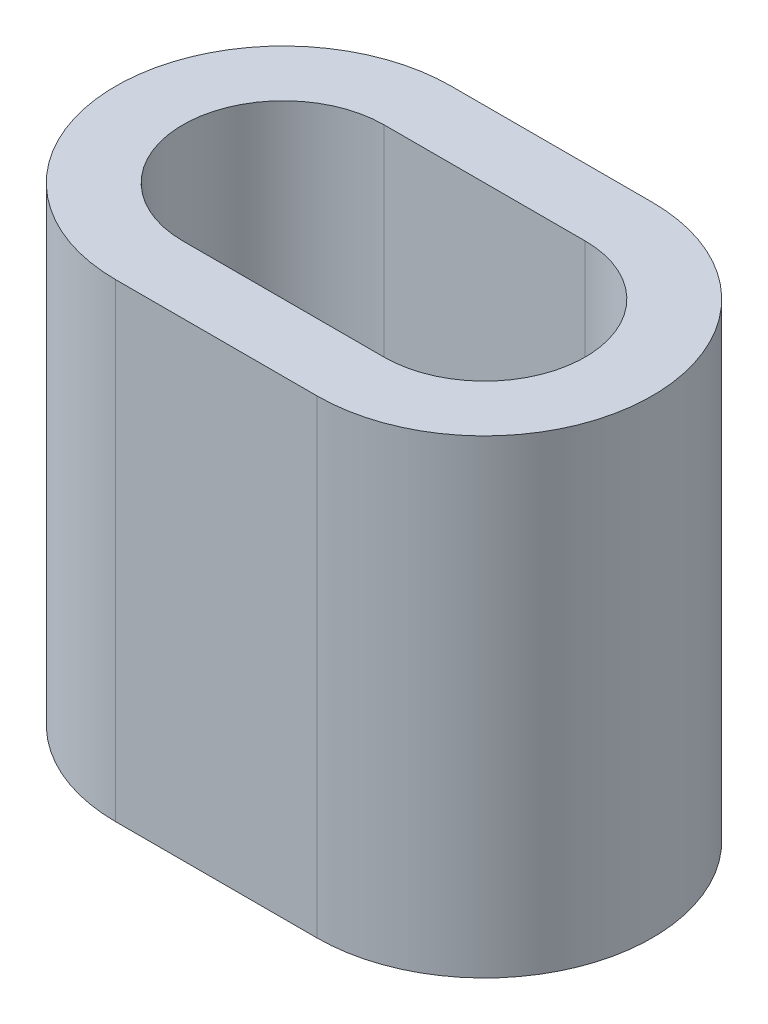
ISO-10303-21;
HEADER;
FILE_DESCRIPTION(('STEP AP214'),'2;1');
FILE_NAME('part.step','',(''),(''),'','','');
FILE_SCHEMA(('AUTOMOTIVE_DESIGN { 1 0 10303 214 1 1 1 1 }'));
ENDSEC;
DATA;
#1=APPLICATION_CONTEXT('core data for automotive mechanical design processes');
#2=APPLICATION_PROTOCOL_DEFINITION('international standard','automotive_design',2000,#1);
#3=PRODUCT_CONTEXT('',#1,'mechanical');
#4=PRODUCT('Part','Part','',(#3));
#5=PRODUCT_RELATED_PRODUCT_CATEGORY('part','',(#4));
#6=PRODUCT_DEFINITION_FORMATION('','',#4);
#7=PRODUCT_DEFINITION_CONTEXT('part definition',#1,'design');
#8=PRODUCT_DEFINITION('design','',#6,#7);
#9=PRODUCT_DEFINITION_SHAPE('','',#8);
#10=(LENGTH_UNIT() NAMED_UNIT(*) SI_UNIT(.MILLI.,.METRE.));
#11=(NAMED_UNIT(*) PLANE_ANGLE_UNIT() SI_UNIT($,.RADIAN.));
#12=(NAMED_UNIT(*) SI_UNIT($,.STERADIAN.) SOLID_ANGLE_UNIT());
#13=UNCERTAINTY_MEASURE_WITH_UNIT(LENGTH_MEASURE(1.E-05),#10,'distance_accuracy_value','');
#14=(GEOMETRIC_REPRESENTATION_CONTEXT(3) GLOBAL_UNCERTAINTY_ASSIGNED_CONTEXT((#13)) GLOBAL_UNIT_ASSIGNED_CONTEXT((#10,
#11,#12)) REPRESENTATION_CONTEXT('',''));
#15=CARTESIAN_POINT('',(0.,0.,0.));
#16=DIRECTION('',(0.,0.,1.));
#17=DIRECTION('',(1.,0.,0.));
#18=AXIS2_PLACEMENT_3D('',#15,#16,#17);
#19=CARTESIAN_POINT('',(1.5,3.5,0.));
#20=DIRECTION('',(0.,1.,0.));
#21=DIRECTION('',(0.,0.,1.));
#22=AXIS2_PLACEMENT_3D('',#19,#20,#21);
#23=PLANE('',#22);
#24=CARTESIAN_POINT('',(1.5,3.5,0.));
#25=DIRECTION('',(0.,1.,0.));
#26=DIRECTION('',(0.,0.,1.));
#27=AXIS2_PLACEMENT_3D('',#24,#25,#26);
#28=CIRCLE('',#27,2.5);
#29=CARTESIAN_POINT('',(1.5,3.5,2.5));
#30=VERTEX_POINT('',#29);
#31=CARTESIAN_POINT('',(1.5,3.5,-2.5));
#32=VERTEX_POINT('',#31);
#33=EDGE_CURVE('E135',#30,#32,#28,.T.);
#34=ORIENTED_EDGE('',*,*,#33,.T.);
#35=DIRECTION('',(-1.,0.,0.));
#36=VECTOR('',#35,1.);
#37=CARTESIAN_POINT('',(1.5,3.5,-2.5));
#38=LINE('',#37,#36);
#39=CARTESIAN_POINT('',(-1.5,3.5,-2.5));
#40=VERTEX_POINT('',#39);
#41=EDGE_CURVE('E138',#32,#40,#38,.T.);
#42=ORIENTED_EDGE('',*,*,#41,.T.);
#43=CARTESIAN_POINT('',(-1.5,3.5,0.));
#44=DIRECTION('',(0.,1.,0.));
#45=DIRECTION('',(0.,0.,1.));
#46=AXIS2_PLACEMENT_3D('',#43,#44,#45);
#47=CIRCLE('',#46,2.5);
#48=CARTESIAN_POINT('',(-1.5,3.5,2.5));
#49=VERTEX_POINT('',#48);
#50=EDGE_CURVE('E141',#40,#49,#47,.T.);
#51=ORIENTED_EDGE('',*,*,#50,.T.);
#52=DIRECTION('',(1.,0.,0.));
#53=VECTOR('',#52,1.);
#54=CARTESIAN_POINT('',(1.5,3.5,2.5));
#55=LINE('',#54,#53);
#56=EDGE_CURVE('E143',#49,#30,#55,.T.);
#57=ORIENTED_EDGE('',*,*,#56,.T.);
#58=EDGE_LOOP('',(#34,#42,#51,#57));
#59=FACE_BOUND('',#58,.T.);
#60=DIRECTION('',(-1.,0.,0.));
#61=VECTOR('',#60,1.);
#62=CARTESIAN_POINT('',(1.5,3.5,-1.49999999999999));
#63=LINE('',#62,#61);
#64=CARTESIAN_POINT('',(1.5,3.5,-1.49999999999999));
#65=VERTEX_POINT('',#64);
#66=CARTESIAN_POINT('',(-1.5,3.5,-1.5));
#67=VERTEX_POINT('',#66);
#68=EDGE_CURVE('E107',#65,#67,#63,.T.);
#69=ORIENTED_EDGE('',*,*,#68,.F.);
#70=CARTESIAN_POINT('',(1.5,3.5,0.));
#71=DIRECTION('',(0.,1.,0.));
#72=DIRECTION('',(0.,0.,1.));
#73=AXIS2_PLACEMENT_3D('',#70,#71,#72);
#74=CIRCLE('',#73,1.5);
#75=CARTESIAN_POINT('',(1.5,3.5,1.5));
#76=VERTEX_POINT('',#75);
#77=EDGE_CURVE('E99',#76,#65,#74,.T.);
#78=ORIENTED_EDGE('',*,*,#77,.F.);
#79=DIRECTION('',(1.,0.,0.));
#80=VECTOR('',#79,1.);
#81=CARTESIAN_POINT('',(1.5,3.5,1.5));
#82=LINE('',#81,#80);
#83=CARTESIAN_POINT('',(-1.5,3.5,1.5));
#84=VERTEX_POINT('',#83);
#85=EDGE_CURVE('E121',#84,#76,#82,.T.);
#86=ORIENTED_EDGE('',*,*,#85,.F.);
#87=CARTESIAN_POINT('',(-1.5,3.5,0.));
#88=DIRECTION('',(0.,1.,0.));
#89=DIRECTION('',(0.,0.,1.));
#90=AXIS2_PLACEMENT_3D('',#87,#88,#89);
#91=CIRCLE('',#90,1.5);
#92=EDGE_CURVE('E119',#67,#84,#91,.T.);
#93=ORIENTED_EDGE('',*,*,#92,.F.);
#94=EDGE_LOOP('',(#69,#78,#86,#93));
#95=FACE_BOUND('',#94,.T.);
#96=ADVANCED_FACE('F34',(#59,#95),#23,.T.);
#97=CARTESIAN_POINT('',(1.5,-3.5,0.));
#98=DIRECTION('',(0.,1.,0.));
#99=DIRECTION('',(0.,0.,1.));
#100=AXIS2_PLACEMENT_3D('',#97,#98,#99);
#101=PLANE('',#100);
#102=CARTESIAN_POINT('',(1.5,-3.5,0.));
#103=DIRECTION('',(0.,1.,0.));
#104=DIRECTION('',(0.,0.,1.));
#105=AXIS2_PLACEMENT_3D('',#102,#103,#104);
#106=CIRCLE('',#105,2.5);
#107=CARTESIAN_POINT('',(1.5,-3.5,2.5));
#108=VERTEX_POINT('',#107);
#109=CARTESIAN_POINT('',(1.5,-3.5,-2.5));
#110=VERTEX_POINT('',#109);
#111=EDGE_CURVE('E115',#108,#110,#106,.T.);
#112=ORIENTED_EDGE('',*,*,#111,.F.);
#113=DIRECTION('',(1.,0.,0.));
#114=VECTOR('',#113,1.);
#115=CARTESIAN_POINT('',(1.5,-3.5,2.5));
#116=LINE('',#115,#114);
#117=CARTESIAN_POINT('',(-1.5,-3.5,2.5));
#118=VERTEX_POINT('',#117);
#119=EDGE_CURVE('E139',#118,#108,#116,.T.);
#120=ORIENTED_EDGE('',*,*,#119,.F.);
#121=CARTESIAN_POINT('',(-1.5,-3.5,0.));
#122=DIRECTION('',(0.,1.,0.));
#123=DIRECTION('',(0.,0.,1.));
#124=AXIS2_PLACEMENT_3D('',#121,#122,#123);
#125=CIRCLE('',#124,2.5);
#126=CARTESIAN_POINT('',(-1.5,-3.5,-2.5));
#127=VERTEX_POINT('',#126);
#128=EDGE_CURVE('E150',#127,#118,#125,.T.);
#129=ORIENTED_EDGE('',*,*,#128,.F.);
#130=DIRECTION('',(-1.,0.,0.));
#131=VECTOR('',#130,1.);
#132=CARTESIAN_POINT('',(1.5,-3.5,-2.5));
#133=LINE('',#132,#131);
#134=EDGE_CURVE('E148',#110,#127,#133,.T.);
#135=ORIENTED_EDGE('',*,*,#134,.F.);
#136=EDGE_LOOP('',(#112,#120,#129,#135));
#137=FACE_BOUND('',#136,.T.);
#138=CARTESIAN_POINT('',(1.5,-3.5,0.));
#139=DIRECTION('',(0.,1.,0.));
#140=DIRECTION('',(0.,0.,1.));
#141=AXIS2_PLACEMENT_3D('',#138,#139,#140);
#142=CIRCLE('',#141,1.5);
#143=CARTESIAN_POINT('',(1.5,-3.5,1.5));
#144=VERTEX_POINT('',#143);
#145=CARTESIAN_POINT('',(1.5,-3.5,-1.49999999999999));
#146=VERTEX_POINT('',#145);
#147=EDGE_CURVE('E57',#144,#146,#142,.T.);
#148=ORIENTED_EDGE('',*,*,#147,.T.);
#149=DIRECTION('',(-1.,0.,0.));
#150=VECTOR('',#149,1.);
#151=CARTESIAN_POINT('',(1.5,-3.5,-1.49999999999999));
#152=LINE('',#151,#150);
#153=CARTESIAN_POINT('',(-1.5,-3.5,-1.5));
#154=VERTEX_POINT('',#153);
#155=EDGE_CURVE('E114',#146,#154,#152,.T.);
#156=ORIENTED_EDGE('',*,*,#155,.T.);
#157=CARTESIAN_POINT('',(-1.5,-3.5,0.));
#158=DIRECTION('',(0.,1.,0.));
#159=DIRECTION('',(0.,0.,1.));
#160=AXIS2_PLACEMENT_3D('',#157,#158,#159);
#161=CIRCLE('',#160,1.5);
#162=CARTESIAN_POINT('',(-1.5,-3.5,1.5));
#163=VERTEX_POINT('',#162);
#164=EDGE_CURVE('E127',#154,#163,#161,.T.);
#165=ORIENTED_EDGE('',*,*,#164,.T.);
#166=DIRECTION('',(1.,0.,0.));
#167=VECTOR('',#166,1.);
#168=CARTESIAN_POINT('',(1.5,-3.5,1.5));
#169=LINE('',#168,#167);
#170=EDGE_CURVE('E108',#163,#144,#169,.T.);
#171=ORIENTED_EDGE('',*,*,#170,.T.);
#172=EDGE_LOOP('',(#148,#156,#165,#171));
#173=FACE_BOUND('',#172,.T.);
#174=ADVANCED_FACE('F168',(#137,#173),#101,.F.);
#175=CARTESIAN_POINT('',(1.5,3.5,0.));
#176=DIRECTION('',(0.,-1.,0.));
#177=DIRECTION('',(0.,0.,-1.));
#178=AXIS2_PLACEMENT_3D('',#175,#176,#177);
#179=CYLINDRICAL_SURFACE('',#178,2.5);
#180=ORIENTED_EDGE('',*,*,#111,.T.);
#181=DIRECTION('',(0.,-1.,0.));
#182=VECTOR('',#181,1.);
#183=CARTESIAN_POINT('',(1.5,3.5,-2.5));
#184=LINE('',#183,#182);
#185=EDGE_CURVE('E11',#32,#110,#184,.T.);
#186=ORIENTED_EDGE('',*,*,#185,.F.);
#187=ORIENTED_EDGE('',*,*,#33,.F.);
#188=DIRECTION('',(0.,-1.,0.));
#189=VECTOR('',#188,1.);
#190=CARTESIAN_POINT('',(1.5,3.5,2.5));
#191=LINE('',#190,#189);
#192=EDGE_CURVE('E145',#30,#108,#191,.T.);
#193=ORIENTED_EDGE('',*,*,#192,.T.);
#194=EDGE_LOOP('',(#180,#186,#187,#193));
#195=FACE_BOUND('',#194,.T.);
#196=ADVANCED_FACE('F36',(#195),#179,.T.);
#197=CARTESIAN_POINT('',(1.5,3.5,-2.5));
#198=DIRECTION('',(0.,0.,1.));
#199=DIRECTION('',(1.,0.,0.));
#200=AXIS2_PLACEMENT_3D('',#197,#198,#199);
#201=PLANE('',#200);
#202=ORIENTED_EDGE('',*,*,#134,.T.);
#203=DIRECTION('',(0.,-1.,0.));
#204=VECTOR('',#203,1.);
#205=CARTESIAN_POINT('',(-1.5,3.5,-2.5));
#206=LINE('',#205,#204);
#207=EDGE_CURVE('E42',#40,#127,#206,.T.);
#208=ORIENTED_EDGE('',*,*,#207,.F.);
#209=ORIENTED_EDGE('',*,*,#41,.F.);
#210=ORIENTED_EDGE('',*,*,#185,.T.);
#211=EDGE_LOOP('',(#202,#208,#209,#210));
#212=FACE_BOUND('',#211,.T.);
#213=ADVANCED_FACE('F178',(#212),#201,.F.);
#214=CARTESIAN_POINT('',(-1.5,3.5,0.));
#215=DIRECTION('',(0.,-1.,0.));
#216=DIRECTION('',(0.,0.,-1.));
#217=AXIS2_PLACEMENT_3D('',#214,#215,#216);
#218=CYLINDRICAL_SURFACE('',#217,2.5);
#219=ORIENTED_EDGE('',*,*,#128,.T.);
#220=DIRECTION('',(0.,-1.,0.));
#221=VECTOR('',#220,1.);
#222=CARTESIAN_POINT('',(-1.5,3.5,2.5));
#223=LINE('',#222,#221);
#224=EDGE_CURVE('E155',#49,#118,#223,.T.);
#225=ORIENTED_EDGE('',*,*,#224,.F.);
#226=ORIENTED_EDGE('',*,*,#50,.F.);
#227=ORIENTED_EDGE('',*,*,#207,.T.);
#228=EDGE_LOOP('',(#219,#225,#226,#227));
#229=FACE_BOUND('',#228,.T.);
#230=ADVANCED_FACE('F162',(#229),#218,.T.);
#231=CARTESIAN_POINT('',(1.5,3.5,2.5));
#232=DIRECTION('',(0.,0.,-1.));
#233=DIRECTION('',(-1.,0.,0.));
#234=AXIS2_PLACEMENT_3D('',#231,#232,#233);
#235=PLANE('',#234);
#236=ORIENTED_EDGE('',*,*,#119,.T.);
#237=ORIENTED_EDGE('',*,*,#192,.F.);
#238=ORIENTED_EDGE('',*,*,#56,.F.);
#239=ORIENTED_EDGE('',*,*,#224,.T.);
#240=EDGE_LOOP('',(#236,#237,#238,#239));
#241=FACE_BOUND('',#240,.T.);
#242=ADVANCED_FACE('F172',(#241),#235,.F.);
#243=CARTESIAN_POINT('',(1.5,3.5,0.));
#244=DIRECTION('',(0.,-1.,0.));
#245=DIRECTION('',(0.,0.,-1.));
#246=AXIS2_PLACEMENT_3D('',#243,#244,#245);
#247=CYLINDRICAL_SURFACE('',#246,1.5);
#248=ORIENTED_EDGE('',*,*,#147,.F.);
#249=DIRECTION('',(0.,-1.,0.));
#250=VECTOR('',#249,1.);
#251=CARTESIAN_POINT('',(1.5,3.5,1.5));
#252=LINE('',#251,#250);
#253=EDGE_CURVE('E103',#76,#144,#252,.T.);
#254=ORIENTED_EDGE('',*,*,#253,.F.);
#255=ORIENTED_EDGE('',*,*,#77,.T.);
#256=DIRECTION('',(0.,-1.,0.));
#257=VECTOR('',#256,1.);
#258=CARTESIAN_POINT('',(1.5,3.5,-1.49999999999999));
#259=LINE('',#258,#257);
#260=EDGE_CURVE('E102',#65,#146,#259,.T.);
#261=ORIENTED_EDGE('',*,*,#260,.T.);
#262=EDGE_LOOP('',(#248,#254,#255,#261));
#263=FACE_BOUND('',#262,.T.);
#264=ADVANCED_FACE('F101',(#263),#247,.F.);
#265=CARTESIAN_POINT('',(1.5,3.5,-1.49999999999999));
#266=DIRECTION('',(0.,0.,1.));
#267=DIRECTION('',(1.,0.,0.));
#268=AXIS2_PLACEMENT_3D('',#265,#266,#267);
#269=PLANE('',#268);
#270=ORIENTED_EDGE('',*,*,#155,.F.);
#271=ORIENTED_EDGE('',*,*,#260,.F.);
#272=ORIENTED_EDGE('',*,*,#68,.T.);
#273=DIRECTION('',(0.,-1.,0.));
#274=VECTOR('',#273,1.);
#275=CARTESIAN_POINT('',(-1.5,3.5,-1.5));
#276=LINE('',#275,#274);
#277=EDGE_CURVE('E116',#67,#154,#276,.T.);
#278=ORIENTED_EDGE('',*,*,#277,.T.);
#279=EDGE_LOOP('',(#270,#271,#272,#278));
#280=FACE_BOUND('',#279,.T.);
#281=ADVANCED_FACE('F111',(#280),#269,.T.);
#282=CARTESIAN_POINT('',(-1.5,3.5,0.));
#283=DIRECTION('',(0.,-1.,0.));
#284=DIRECTION('',(0.,0.,-1.));
#285=AXIS2_PLACEMENT_3D('',#282,#283,#284);
#286=CYLINDRICAL_SURFACE('',#285,1.5);
#287=ORIENTED_EDGE('',*,*,#164,.F.);
#288=ORIENTED_EDGE('',*,*,#277,.F.);
#289=ORIENTED_EDGE('',*,*,#92,.T.);
#290=DIRECTION('',(0.,-1.,0.));
#291=VECTOR('',#290,1.);
#292=CARTESIAN_POINT('',(-1.5,3.5,1.5));
#293=LINE('',#292,#291);
#294=EDGE_CURVE('E49',#84,#163,#293,.T.);
#295=ORIENTED_EDGE('',*,*,#294,.T.);
#296=EDGE_LOOP('',(#287,#288,#289,#295));
#297=FACE_BOUND('',#296,.T.);
#298=ADVANCED_FACE('F201',(#297),#286,.F.);
#299=CARTESIAN_POINT('',(1.5,3.5,1.5));
#300=DIRECTION('',(0.,0.,-1.));
#301=DIRECTION('',(-1.,0.,0.));
#302=AXIS2_PLACEMENT_3D('',#299,#300,#301);
#303=PLANE('',#302);
#304=ORIENTED_EDGE('',*,*,#170,.F.);
#305=ORIENTED_EDGE('',*,*,#294,.F.);
#306=ORIENTED_EDGE('',*,*,#85,.T.);
#307=ORIENTED_EDGE('',*,*,#253,.T.);
#308=EDGE_LOOP('',(#304,#305,#306,#307));
#309=FACE_BOUND('',#308,.T.);
#310=ADVANCED_FACE('F205',(#309),#303,.T.);
#311=CLOSED_SHELL('',(#96,#174,#196,#213,#230,#242,#264,#281,#298,#310));
#312=MANIFOLD_SOLID_BREP('B2',#311);
#313=ADVANCED_BREP_SHAPE_REPRESENTATION('',(#18,#312),#14);
#314=SHAPE_DEFINITION_REPRESENTATION(#9,#313);
ENDSEC;
END-ISO-10303-21;
